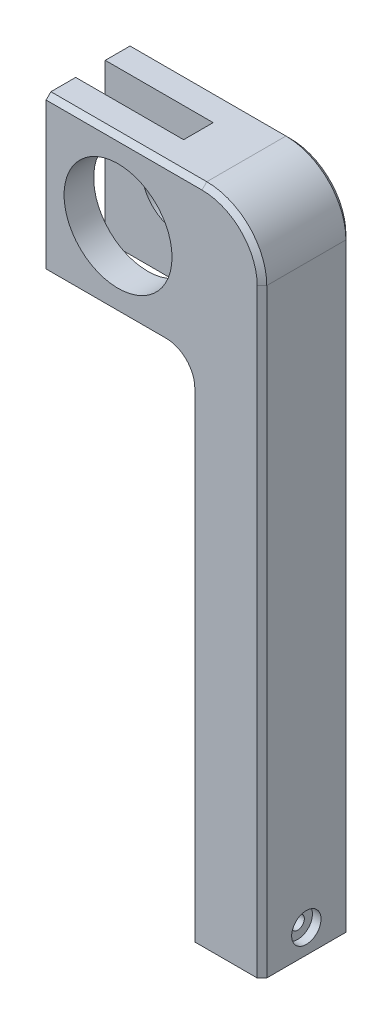
ISO-10303-21;
HEADER;
FILE_DESCRIPTION(('STEP AP214'),'2;1');
FILE_NAME('part.step','',(''),(''),'','','');
FILE_SCHEMA(('AUTOMOTIVE_DESIGN { 1 0 10303 214 1 1 1 1 }'));
ENDSEC;
DATA;
#1=APPLICATION_CONTEXT('core data for automotive mechanical design processes');
#2=APPLICATION_PROTOCOL_DEFINITION('international standard','automotive_design',2000,#1);
#3=PRODUCT_CONTEXT('',#1,'mechanical');
#4=PRODUCT('Part','Part','',(#3));
#5=PRODUCT_RELATED_PRODUCT_CATEGORY('part','',(#4));
#6=PRODUCT_DEFINITION_FORMATION('','',#4);
#7=PRODUCT_DEFINITION_CONTEXT('part definition',#1,'design');
#8=PRODUCT_DEFINITION('design','',#6,#7);
#9=PRODUCT_DEFINITION_SHAPE('','',#8);
#10=(LENGTH_UNIT() NAMED_UNIT(*) SI_UNIT(.MILLI.,.METRE.));
#11=(NAMED_UNIT(*) PLANE_ANGLE_UNIT() SI_UNIT($,.RADIAN.));
#12=(NAMED_UNIT(*) SI_UNIT($,.STERADIAN.) SOLID_ANGLE_UNIT());
#13=UNCERTAINTY_MEASURE_WITH_UNIT(LENGTH_MEASURE(1.E-05),#10,'distance_accuracy_value','');
#14=(GEOMETRIC_REPRESENTATION_CONTEXT(3) GLOBAL_UNCERTAINTY_ASSIGNED_CONTEXT((#13)) GLOBAL_UNIT_ASSIGNED_CONTEXT((#10,
#11,#12)) REPRESENTATION_CONTEXT('',''));
#15=CARTESIAN_POINT('',(0.,0.,0.));
#16=DIRECTION('',(0.,0.,1.));
#17=DIRECTION('',(1.,0.,0.));
#18=AXIS2_PLACEMENT_3D('',#15,#16,#17);
#19=CARTESIAN_POINT('',(-45.,-0.00100000000002876,6.16499999999999));
#20=DIRECTION('',(0.,0.,1.));
#21=DIRECTION('',(1.,0.,0.));
#22=AXIS2_PLACEMENT_3D('',#19,#20,#21);
#23=PLANE('',#22);
#24=CARTESIAN_POINT('',(-60.,242.5,6.16499999999999));
#25=DIRECTION('',(0.,0.,1.));
#26=DIRECTION('',(1.,0.,0.));
#27=AXIS2_PLACEMENT_3D('',#24,#25,#26);
#28=CIRCLE('',#27,22.5);
#29=CARTESIAN_POINT('',(-45.,225.729490168752,6.16499999999999));
#30=VERTEX_POINT('',#29);
#31=CARTESIAN_POINT('',(-45.,259.270509831248,6.16499999999999));
#32=VERTEX_POINT('',#31);
#33=EDGE_CURVE('E260',#30,#32,#28,.F.);
#34=ORIENTED_EDGE('',*,*,#33,.F.);
#35=DIRECTION('',(0.,1.,0.));
#36=VECTOR('',#35,1.);
#37=CARTESIAN_POINT('',(-45.,-0.00100000000002876,6.16499999999999));
#38=LINE('',#37,#36);
#39=CARTESIAN_POINT('',(-45.,210.,6.16499999999999));
#40=VERTEX_POINT('',#39);
#41=EDGE_CURVE('E281',#40,#30,#38,.T.);
#42=ORIENTED_EDGE('',*,*,#41,.F.);
#43=DIRECTION('',(1.,0.,0.));
#44=VECTOR('',#43,1.);
#45=CARTESIAN_POINT('',(-45.,210.,6.16499999999999));
#46=LINE('',#45,#44);
#47=CARTESIAN_POINT('',(-90.,210.,6.165));
#48=VERTEX_POINT('',#47);
#49=EDGE_CURVE('E277',#48,#40,#46,.T.);
#50=ORIENTED_EDGE('',*,*,#49,.F.);
#51=DIRECTION('',(0.,1.,0.));
#52=VECTOR('',#51,1.);
#53=CARTESIAN_POINT('',(-90.,-0.00100000000002876,6.165));
#54=LINE('',#53,#52);
#55=CARTESIAN_POINT('',(-90.,275.,6.165));
#56=VERTEX_POINT('',#55);
#57=EDGE_CURVE('E279',#48,#56,#54,.T.);
#58=ORIENTED_EDGE('',*,*,#57,.T.);
#59=DIRECTION('',(1.,0.,0.));
#60=VECTOR('',#59,1.);
#61=CARTESIAN_POINT('',(-45.,275.,6.16499999999999));
#62=LINE('',#61,#60);
#63=CARTESIAN_POINT('',(-45.,275.,6.16499999999999));
#64=VERTEX_POINT('',#63);
#65=EDGE_CURVE('E270',#56,#64,#62,.T.);
#66=ORIENTED_EDGE('',*,*,#65,.T.);
#67=EDGE_CURVE('E290',#32,#64,#38,.T.);
#68=ORIENTED_EDGE('',*,*,#67,.F.);
#69=EDGE_LOOP('',(#34,#42,#50,#58,#66,#68));
#70=FACE_BOUND('',#69,.T.);
#71=ADVANCED_FACE('F44',(#70),#23,.F.);
#72=CARTESIAN_POINT('',(-90.,210.,-18.5));
#73=DIRECTION('',(-1.,0.,0.));
#74=DIRECTION('',(0.,0.,1.));
#75=AXIS2_PLACEMENT_3D('',#72,#73,#74);
#76=PLANE('',#75);
#77=CARTESIAN_POINT('',(-90.,215.,-12.33));
#78=DIRECTION('',(-1.,0.,0.));
#79=DIRECTION('',(0.,0.,1.));
#80=AXIS2_PLACEMENT_3D('',#77,#78,#79);
#81=CIRCLE('',#80,1.5);
#82=CARTESIAN_POINT('',(-90.,215.,-10.83));
#83=VERTEX_POINT('',#82);
#84=EDGE_CURVE('E214',#83,#83,#81,.T.);
#85=ORIENTED_EDGE('',*,*,#84,.F.);
#86=EDGE_LOOP('',(#85));
#87=FACE_BOUND('',#86,.T.);
#88=CARTESIAN_POINT('',(-90.,270.,-12.33));
#89=DIRECTION('',(-1.,0.,0.));
#90=DIRECTION('',(0.,0.,1.));
#91=AXIS2_PLACEMENT_3D('',#88,#89,#90);
#92=CIRCLE('',#91,1.5);
#93=CARTESIAN_POINT('',(-90.,270.,-10.83));
#94=VERTEX_POINT('',#93);
#95=EDGE_CURVE('E225',#94,#94,#92,.T.);
#96=ORIENTED_EDGE('',*,*,#95,.F.);
#97=EDGE_LOOP('',(#96));
#98=FACE_BOUND('',#97,.T.);
#99=DIRECTION('',(0.,-1.,0.));
#100=VECTOR('',#99,1.);
#101=CARTESIAN_POINT('',(-90.,210.,-18.5));
#102=LINE('',#101,#100);
#103=CARTESIAN_POINT('',(-90.,273.,-18.5));
#104=VERTEX_POINT('',#103);
#105=CARTESIAN_POINT('',(-90.,212.,-18.5));
#106=VERTEX_POINT('',#105);
#107=EDGE_CURVE('E292',#104,#106,#102,.T.);
#108=ORIENTED_EDGE('',*,*,#107,.T.);
#109=DIRECTION('',(0.,0.707106781186548,-0.707106781186548));
#110=VECTOR('',#109,1.);
#111=CARTESIAN_POINT('',(-90.,211.,-17.5));
#112=LINE('',#111,#110);
#113=CARTESIAN_POINT('',(-90.,210.,-16.5));
#114=VERTEX_POINT('',#113);
#115=EDGE_CURVE('E378',#106,#114,#112,.F.);
#116=ORIENTED_EDGE('',*,*,#115,.T.);
#117=DIRECTION('',(0.,0.,1.));
#118=VECTOR('',#117,1.);
#119=CARTESIAN_POINT('',(-90.,210.,-18.5));
#120=LINE('',#119,#118);
#121=CARTESIAN_POINT('',(-90.,210.,-6.165));
#122=VERTEX_POINT('',#121);
#123=EDGE_CURVE('E311',#114,#122,#120,.T.);
#124=ORIENTED_EDGE('',*,*,#123,.T.);
#125=DIRECTION('',(0.,1.,0.));
#126=VECTOR('',#125,1.);
#127=CARTESIAN_POINT('',(-90.,-0.00100000000002876,-6.165));
#128=LINE('',#127,#126);
#129=CARTESIAN_POINT('',(-90.,275.,-6.165));
#130=VERTEX_POINT('',#129);
#131=EDGE_CURVE('E276',#122,#130,#128,.T.);
#132=ORIENTED_EDGE('',*,*,#131,.T.);
#133=DIRECTION('',(0.,0.,1.));
#134=VECTOR('',#133,1.);
#135=CARTESIAN_POINT('',(-90.,275.,-18.5));
#136=LINE('',#135,#134);
#137=CARTESIAN_POINT('',(-90.,275.,-16.5));
#138=VERTEX_POINT('',#137);
#139=EDGE_CURVE('E313',#138,#130,#136,.T.);
#140=ORIENTED_EDGE('',*,*,#139,.F.);
#141=DIRECTION('',(0.,0.707106781186548,0.707106781186548));
#142=VECTOR('',#141,1.);
#143=CARTESIAN_POINT('',(-90.,241.5,-50.));
#144=LINE('',#143,#142);
#145=EDGE_CURVE('E380',#138,#104,#144,.F.);
#146=ORIENTED_EDGE('',*,*,#145,.T.);
#147=EDGE_LOOP('',(#108,#116,#124,#132,#140,#146));
#148=FACE_BOUND('',#147,.T.);
#149=ADVANCED_FACE('F497',(#87,#98,#148),#76,.T.);
#150=CARTESIAN_POINT('',(-30.,210.,-18.5));
#151=DIRECTION('',(0.,-1.,0.));
#152=DIRECTION('',(0.,0.,-1.));
#153=AXIS2_PLACEMENT_3D('',#150,#151,#152);
#154=PLANE('',#153);
#155=DIRECTION('',(0.,0.,1.));
#156=VECTOR('',#155,1.);
#157=CARTESIAN_POINT('',(-40.,210.,18.5));
#158=LINE('',#157,#156);
#159=CARTESIAN_POINT('',(-40.,210.,-16.5));
#160=VERTEX_POINT('',#159);
#161=CARTESIAN_POINT('',(-40.,210.,16.5));
#162=VERTEX_POINT('',#161);
#163=EDGE_CURVE('E318',#160,#162,#158,.T.);
#164=ORIENTED_EDGE('',*,*,#163,.T.);
#165=DIRECTION('',(-1.,0.,0.));
#166=VECTOR('',#165,1.);
#167=CARTESIAN_POINT('',(-90.,210.,16.5));
#168=LINE('',#167,#166);
#169=CARTESIAN_POINT('',(-90.,210.,16.5));
#170=VERTEX_POINT('',#169);
#171=EDGE_CURVE('E345',#162,#170,#168,.T.);
#172=ORIENTED_EDGE('',*,*,#171,.T.);
#173=EDGE_CURVE('E312',#48,#170,#120,.T.);
#174=ORIENTED_EDGE('',*,*,#173,.F.);
#175=ORIENTED_EDGE('',*,*,#49,.T.);
#176=DIRECTION('',(0.,0.,-1.));
#177=VECTOR('',#176,1.);
#178=CARTESIAN_POINT('',(-45.,210.,6.16499999999999));
#179=LINE('',#178,#177);
#180=CARTESIAN_POINT('',(-45.,210.,-6.16499999999999));
#181=VERTEX_POINT('',#180);
#182=EDGE_CURVE('E263',#40,#181,#179,.T.);
#183=ORIENTED_EDGE('',*,*,#182,.T.);
#184=DIRECTION('',(-1.,0.,0.));
#185=VECTOR('',#184,1.);
#186=CARTESIAN_POINT('',(-45.,210.,-6.16499999999999));
#187=LINE('',#186,#185);
#188=EDGE_CURVE('E264',#181,#122,#187,.T.);
#189=ORIENTED_EDGE('',*,*,#188,.T.);
#190=ORIENTED_EDGE('',*,*,#123,.F.);
#191=DIRECTION('',(1.,0.,0.));
#192=VECTOR('',#191,1.);
#193=CARTESIAN_POINT('',(-30.,210.,-16.5));
#194=LINE('',#193,#192);
#195=EDGE_CURVE('E338',#114,#160,#194,.T.);
#196=ORIENTED_EDGE('',*,*,#195,.T.);
#197=EDGE_LOOP('',(#164,#172,#174,#175,#183,#189,#190,#196));
#198=FACE_BOUND('',#197,.T.);
#199=ADVANCED_FACE('F474',(#198),#154,.T.);
#200=CARTESIAN_POINT('',(0.,275.,-18.5));
#201=DIRECTION('',(1.,0.,0.));
#202=DIRECTION('',(0.,1.,0.));
#203=AXIS2_PLACEMENT_3D('',#200,#201,#202);
#204=PLANE('',#203);
#205=CARTESIAN_POINT('',(0.,10.,0.));
#206=DIRECTION('',(1.,0.,0.));
#207=DIRECTION('',(0.,0.,-1.));
#208=AXIS2_PLACEMENT_3D('',#205,#206,#207);
#209=CIRCLE('',#208,6.12);
#210=CARTESIAN_POINT('',(0.,10.,-6.12));
#211=VERTEX_POINT('',#210);
#212=EDGE_CURVE('E234',#211,#211,#209,.T.);
#213=ORIENTED_EDGE('',*,*,#212,.F.);
#214=EDGE_LOOP('',(#213));
#215=FACE_BOUND('',#214,.T.);
#216=DIRECTION('',(0.,0.,1.));
#217=VECTOR('',#216,1.);
#218=CARTESIAN_POINT('',(0.,0.,-18.5));
#219=LINE('',#218,#217);
#220=CARTESIAN_POINT('',(0.,0.,-16.5));
#221=VERTEX_POINT('',#220);
#222=CARTESIAN_POINT('',(0.,0.,16.5));
#223=VERTEX_POINT('',#222);
#224=EDGE_CURVE('E302',#221,#223,#219,.T.);
#225=ORIENTED_EDGE('',*,*,#224,.F.);
#226=DIRECTION('',(0.,1.,0.));
#227=VECTOR('',#226,1.);
#228=CARTESIAN_POINT('',(0.,275.,-16.5));
#229=LINE('',#228,#227);
#230=CARTESIAN_POINT('',(0.,250.,-16.5));
#231=VERTEX_POINT('',#230);
#232=EDGE_CURVE('E11',#221,#231,#229,.T.);
#233=ORIENTED_EDGE('',*,*,#232,.T.);
#234=DIRECTION('',(0.,0.,1.));
#235=VECTOR('',#234,1.);
#236=CARTESIAN_POINT('',(0.,250.,-18.5));
#237=LINE('',#236,#235);
#238=CARTESIAN_POINT('',(0.,250.,16.5));
#239=VERTEX_POINT('',#238);
#240=EDGE_CURVE('E310',#231,#239,#237,.T.);
#241=ORIENTED_EDGE('',*,*,#240,.T.);
#242=DIRECTION('',(0.,-1.,0.));
#243=VECTOR('',#242,1.);
#244=CARTESIAN_POINT('',(0.,0.,16.5));
#245=LINE('',#244,#243);
#246=EDGE_CURVE('E54',#239,#223,#245,.T.);
#247=ORIENTED_EDGE('',*,*,#246,.T.);
#248=EDGE_LOOP('',(#225,#233,#241,#247));
#249=FACE_BOUND('',#248,.T.);
#250=ADVANCED_FACE('F419',(#215,#249),#204,.T.);
#251=CARTESIAN_POINT('',(0.,0.,-18.5));
#252=DIRECTION('',(0.,-1.,0.));
#253=DIRECTION('',(1.,0.,0.));
#254=AXIS2_PLACEMENT_3D('',#251,#252,#253);
#255=PLANE('',#254);
#256=DIRECTION('',(1.,0.,0.));
#257=VECTOR('',#256,1.);
#258=CARTESIAN_POINT('',(0.,0.,18.5));
#259=LINE('',#258,#257);
#260=CARTESIAN_POINT('',(-28.,0.,18.5));
#261=VERTEX_POINT('',#260);
#262=CARTESIAN_POINT('',(-2.,0.,18.5));
#263=VERTEX_POINT('',#262);
#264=EDGE_CURVE('E298',#261,#263,#259,.T.);
#265=ORIENTED_EDGE('',*,*,#264,.F.);
#266=DIRECTION('',(-0.707106781186548,0.,-0.707106781186548));
#267=VECTOR('',#266,1.);
#268=CARTESIAN_POINT('',(-32.5,0.,14.));
#269=LINE('',#268,#267);
#270=CARTESIAN_POINT('',(-30.,0.,16.5));
#271=VERTEX_POINT('',#270);
#272=EDGE_CURVE('E360',#261,#271,#269,.T.);
#273=ORIENTED_EDGE('',*,*,#272,.T.);
#274=DIRECTION('',(0.,0.,1.));
#275=VECTOR('',#274,1.);
#276=CARTESIAN_POINT('',(-30.,0.,-18.5));
#277=LINE('',#276,#275);
#278=CARTESIAN_POINT('',(-30.,0.,-16.5));
#279=VERTEX_POINT('',#278);
#280=EDGE_CURVE('E308',#279,#271,#277,.T.);
#281=ORIENTED_EDGE('',*,*,#280,.F.);
#282=DIRECTION('',(-0.707106781186548,0.,0.707106781186548));
#283=VECTOR('',#282,1.);
#284=CARTESIAN_POINT('',(-14.,0.,-32.5));
#285=LINE('',#284,#283);
#286=CARTESIAN_POINT('',(-28.,0.,-18.5));
#287=VERTEX_POINT('',#286);
#288=EDGE_CURVE('E357',#279,#287,#285,.F.);
#289=ORIENTED_EDGE('',*,*,#288,.T.);
#290=DIRECTION('',(1.,0.,0.));
#291=VECTOR('',#290,1.);
#292=CARTESIAN_POINT('',(0.,0.,-18.5));
#293=LINE('',#292,#291);
#294=CARTESIAN_POINT('',(-2.,0.,-18.5));
#295=VERTEX_POINT('',#294);
#296=EDGE_CURVE('E294',#287,#295,#293,.T.);
#297=ORIENTED_EDGE('',*,*,#296,.T.);
#298=DIRECTION('',(-0.707106781186548,0.,-0.707106781186548));
#299=VECTOR('',#298,1.);
#300=CARTESIAN_POINT('',(-1.,0.,-17.5));
#301=LINE('',#300,#299);
#302=EDGE_CURVE('E353',#295,#221,#301,.F.);
#303=ORIENTED_EDGE('',*,*,#302,.T.);
#304=ORIENTED_EDGE('',*,*,#224,.T.);
#305=DIRECTION('',(-0.707106781186548,0.,0.707106781186548));
#306=VECTOR('',#305,1.);
#307=CARTESIAN_POINT('',(17.5,0.,-1.));
#308=LINE('',#307,#306);
#309=EDGE_CURVE('E354',#223,#263,#308,.T.);
#310=ORIENTED_EDGE('',*,*,#309,.T.);
#311=EDGE_LOOP('',(#265,#273,#281,#289,#297,#303,#304,#310));
#312=FACE_BOUND('',#311,.T.);
#313=ADVANCED_FACE('F423',(#312),#255,.T.);
#314=CARTESIAN_POINT('',(-30.,210.,-18.5));
#315=DIRECTION('',(-1.,0.,0.));
#316=DIRECTION('',(0.,-1.,0.));
#317=AXIS2_PLACEMENT_3D('',#314,#315,#316);
#318=PLANE('',#317);
#319=CARTESIAN_POINT('',(-30.,10.,0.));
#320=DIRECTION('',(-1.,0.,0.));
#321=DIRECTION('',(0.,-1.,0.));
#322=AXIS2_PLACEMENT_3D('',#319,#320,#321);
#323=CIRCLE('',#322,2.75);
#324=CARTESIAN_POINT('',(-30.,7.25,0.));
#325=VERTEX_POINT('',#324);
#326=EDGE_CURVE('E243',#325,#325,#323,.T.);
#327=ORIENTED_EDGE('',*,*,#326,.F.);
#328=EDGE_LOOP('',(#327));
#329=FACE_BOUND('',#328,.T.);
#330=ORIENTED_EDGE('',*,*,#280,.T.);
#331=DIRECTION('',(0.,1.,0.));
#332=VECTOR('',#331,1.);
#333=CARTESIAN_POINT('',(-30.,200.,16.5));
#334=LINE('',#333,#332);
#335=CARTESIAN_POINT('',(-30.,200.,16.5));
#336=VERTEX_POINT('',#335);
#337=EDGE_CURVE('E361',#271,#336,#334,.T.);
#338=ORIENTED_EDGE('',*,*,#337,.T.);
#339=DIRECTION('',(0.,0.,1.));
#340=VECTOR('',#339,1.);
#341=CARTESIAN_POINT('',(-30.,200.,-18.5));
#342=LINE('',#341,#340);
#343=CARTESIAN_POINT('',(-30.,200.,-16.5));
#344=VERTEX_POINT('',#343);
#345=EDGE_CURVE('E325',#336,#344,#342,.F.);
#346=ORIENTED_EDGE('',*,*,#345,.T.);
#347=DIRECTION('',(0.,-1.,0.));
#348=VECTOR('',#347,1.);
#349=CARTESIAN_POINT('',(-30.,210.,-16.5));
#350=LINE('',#349,#348);
#351=EDGE_CURVE('E363',#344,#279,#350,.T.);
#352=ORIENTED_EDGE('',*,*,#351,.T.);
#353=EDGE_LOOP('',(#330,#338,#346,#352));
#354=FACE_BOUND('',#353,.T.);
#355=ADVANCED_FACE('F488',(#329,#354),#318,.T.);
#356=CARTESIAN_POINT('',(-90.,270.,12.33));
#357=DIRECTION('',(-1.,0.,0.));
#358=DIRECTION('',(0.,0.,1.));
#359=AXIS2_PLACEMENT_3D('',#356,#357,#358);
#360=CIRCLE('',#359,1.5);
#361=CARTESIAN_POINT('',(-90.,270.,13.83));
#362=VERTEX_POINT('',#361);
#363=EDGE_CURVE('E211',#362,#362,#360,.T.);
#364=ORIENTED_EDGE('',*,*,#363,.F.);
#365=EDGE_LOOP('',(#364));
#366=FACE_BOUND('',#365,.T.);
#367=CARTESIAN_POINT('',(-90.,215.,12.33));
#368=DIRECTION('',(-1.,0.,0.));
#369=DIRECTION('',(0.,0.,1.));
#370=AXIS2_PLACEMENT_3D('',#367,#368,#369);
#371=CIRCLE('',#370,1.5);
#372=CARTESIAN_POINT('',(-90.,215.,13.83));
#373=VERTEX_POINT('',#372);
#374=EDGE_CURVE('E226',#373,#373,#371,.T.);
#375=ORIENTED_EDGE('',*,*,#374,.F.);
#376=EDGE_LOOP('',(#375));
#377=FACE_BOUND('',#376,.T.);
#378=ORIENTED_EDGE('',*,*,#173,.T.);
#379=DIRECTION('',(0.,0.707106781186548,0.707106781186548));
#380=VECTOR('',#379,1.);
#381=CARTESIAN_POINT('',(-90.,192.5,-1.00000000000001));
#382=LINE('',#381,#380);
#383=CARTESIAN_POINT('',(-90.,212.,18.5));
#384=VERTEX_POINT('',#383);
#385=EDGE_CURVE('E350',#170,#384,#382,.T.);
#386=ORIENTED_EDGE('',*,*,#385,.T.);
#387=DIRECTION('',(0.,-1.,0.));
#388=VECTOR('',#387,1.);
#389=CARTESIAN_POINT('',(-90.,210.,18.5));
#390=LINE('',#389,#388);
#391=CARTESIAN_POINT('',(-90.,273.,18.5));
#392=VERTEX_POINT('',#391);
#393=EDGE_CURVE('E293',#392,#384,#390,.T.);
#394=ORIENTED_EDGE('',*,*,#393,.F.);
#395=DIRECTION('',(0.,0.707106781186548,-0.707106781186548));
#396=VECTOR('',#395,1.);
#397=CARTESIAN_POINT('',(-90.,260.,31.5));
#398=LINE('',#397,#396);
#399=CARTESIAN_POINT('',(-90.,275.,16.5));
#400=VERTEX_POINT('',#399);
#401=EDGE_CURVE('E342',#392,#400,#398,.T.);
#402=ORIENTED_EDGE('',*,*,#401,.T.);
#403=EDGE_CURVE('E299',#56,#400,#136,.T.);
#404=ORIENTED_EDGE('',*,*,#403,.F.);
#405=ORIENTED_EDGE('',*,*,#57,.F.);
#406=EDGE_LOOP('',(#378,#386,#394,#402,#404,#405));
#407=FACE_BOUND('',#406,.T.);
#408=ADVANCED_FACE('F449',(#366,#377,#407),#76,.T.);
#409=CARTESIAN_POINT('',(-90.,275.,-18.5));
#410=DIRECTION('',(0.,1.,0.));
#411=DIRECTION('',(0.,0.,1.));
#412=AXIS2_PLACEMENT_3D('',#409,#410,#411);
#413=PLANE('',#412);
#414=DIRECTION('',(0.,0.,1.));
#415=VECTOR('',#414,1.);
#416=CARTESIAN_POINT('',(-25.,275.,-18.5));
#417=LINE('',#416,#415);
#418=CARTESIAN_POINT('',(-25.,275.,16.5));
#419=VERTEX_POINT('',#418);
#420=CARTESIAN_POINT('',(-25.,275.,-16.5));
#421=VERTEX_POINT('',#420);
#422=EDGE_CURVE('E320',#419,#421,#417,.F.);
#423=ORIENTED_EDGE('',*,*,#422,.T.);
#424=DIRECTION('',(-1.,0.,0.));
#425=VECTOR('',#424,1.);
#426=CARTESIAN_POINT('',(-90.,275.,-16.5));
#427=LINE('',#426,#425);
#428=EDGE_CURVE('E384',#421,#138,#427,.T.);
#429=ORIENTED_EDGE('',*,*,#428,.T.);
#430=ORIENTED_EDGE('',*,*,#139,.T.);
#431=DIRECTION('',(-1.,0.,0.));
#432=VECTOR('',#431,1.);
#433=CARTESIAN_POINT('',(-45.,275.,-6.16499999999999));
#434=LINE('',#433,#432);
#435=CARTESIAN_POINT('',(-45.,275.,-6.16499999999999));
#436=VERTEX_POINT('',#435);
#437=EDGE_CURVE('E271',#436,#130,#434,.T.);
#438=ORIENTED_EDGE('',*,*,#437,.F.);
#439=DIRECTION('',(0.,0.,-1.));
#440=VECTOR('',#439,1.);
#441=CARTESIAN_POINT('',(-45.,275.,6.16499999999999));
#442=LINE('',#441,#440);
#443=EDGE_CURVE('E268',#64,#436,#442,.T.);
#444=ORIENTED_EDGE('',*,*,#443,.F.);
#445=ORIENTED_EDGE('',*,*,#65,.F.);
#446=ORIENTED_EDGE('',*,*,#403,.T.);
#447=DIRECTION('',(1.,0.,0.));
#448=VECTOR('',#447,1.);
#449=CARTESIAN_POINT('',(-25.,275.,16.5));
#450=LINE('',#449,#448);
#451=EDGE_CURVE('E382',#400,#419,#450,.T.);
#452=ORIENTED_EDGE('',*,*,#451,.T.);
#453=EDGE_LOOP('',(#423,#429,#430,#438,#444,#445,#446,#452));
#454=FACE_BOUND('',#453,.T.);
#455=ADVANCED_FACE('F436',(#454),#413,.T.);
#456=CARTESIAN_POINT('',(0.,0.,-18.5));
#457=DIRECTION('',(0.,0.,-1.));
#458=DIRECTION('',(-1.,0.,0.));
#459=AXIS2_PLACEMENT_3D('',#456,#457,#458);
#460=PLANE('',#459);
#461=CARTESIAN_POINT('',(-60.,242.5,-18.5));
#462=DIRECTION('',(0.,0.,-1.));
#463=DIRECTION('',(-1.,0.,0.));
#464=AXIS2_PLACEMENT_3D('',#461,#462,#463);
#465=CIRCLE('',#464,14.625);
#466=CARTESIAN_POINT('',(-74.625,242.5,-18.5));
#467=VERTEX_POINT('',#466);
#468=EDGE_CURVE('E250',#467,#467,#465,.T.);
#469=ORIENTED_EDGE('',*,*,#468,.F.);
#470=EDGE_LOOP('',(#469));
#471=FACE_BOUND('',#470,.T.);
#472=CARTESIAN_POINT('',(-40.,200.,-18.5));
#473=DIRECTION('',(0.,0.,-1.));
#474=DIRECTION('',(-1.,0.,0.));
#475=AXIS2_PLACEMENT_3D('',#472,#473,#474);
#476=CIRCLE('',#475,12.);
#477=CARTESIAN_POINT('',(-28.,200.,-18.5));
#478=VERTEX_POINT('',#477);
#479=CARTESIAN_POINT('',(-40.,212.,-18.5));
#480=VERTEX_POINT('',#479);
#481=EDGE_CURVE('E373',#478,#480,#476,.F.);
#482=ORIENTED_EDGE('',*,*,#481,.T.);
#483=DIRECTION('',(-1.,0.,0.));
#484=VECTOR('',#483,1.);
#485=CARTESIAN_POINT('',(0.,212.,-18.5));
#486=LINE('',#485,#484);
#487=EDGE_CURVE('E374',#480,#106,#486,.T.);
#488=ORIENTED_EDGE('',*,*,#487,.T.);
#489=ORIENTED_EDGE('',*,*,#107,.F.);
#490=DIRECTION('',(1.,0.,0.));
#491=VECTOR('',#490,1.);
#492=CARTESIAN_POINT('',(0.,273.,-18.5));
#493=LINE('',#492,#491);
#494=CARTESIAN_POINT('',(-25.,273.,-18.5));
#495=VERTEX_POINT('',#494);
#496=EDGE_CURVE('E367',#104,#495,#493,.T.);
#497=ORIENTED_EDGE('',*,*,#496,.T.);
#498=CARTESIAN_POINT('',(-25.,250.,-18.5));
#499=DIRECTION('',(0.,0.,-1.));
#500=DIRECTION('',(-1.,0.,0.));
#501=AXIS2_PLACEMENT_3D('',#498,#499,#500);
#502=CIRCLE('',#501,23.);
#503=CARTESIAN_POINT('',(-2.00000000000001,250.,-18.5));
#504=VERTEX_POINT('',#503);
#505=EDGE_CURVE('E370',#495,#504,#502,.T.);
#506=ORIENTED_EDGE('',*,*,#505,.T.);
#507=DIRECTION('',(0.,-1.,0.));
#508=VECTOR('',#507,1.);
#509=CARTESIAN_POINT('',(-2.,0.,-18.5));
#510=LINE('',#509,#508);
#511=EDGE_CURVE('E362',#504,#295,#510,.T.);
#512=ORIENTED_EDGE('',*,*,#511,.T.);
#513=ORIENTED_EDGE('',*,*,#296,.F.);
#514=DIRECTION('',(0.,1.,0.));
#515=VECTOR('',#514,1.);
#516=CARTESIAN_POINT('',(-28.,0.,-18.5));
#517=LINE('',#516,#515);
#518=EDGE_CURVE('E371',#287,#478,#517,.T.);
#519=ORIENTED_EDGE('',*,*,#518,.T.);
#520=EDGE_LOOP('',(#482,#488,#489,#497,#506,#512,#513,#519));
#521=FACE_BOUND('',#520,.T.);
#522=ADVANCED_FACE('F491',(#471,#521),#460,.T.);
#523=CARTESIAN_POINT('',(0.,0.,18.5));
#524=DIRECTION('',(0.,0.,-1.));
#525=DIRECTION('',(-1.,0.,0.));
#526=AXIS2_PLACEMENT_3D('',#523,#524,#525);
#527=PLANE('',#526);
#528=CARTESIAN_POINT('',(-60.,242.5,18.5));
#529=DIRECTION('',(0.,0.,1.));
#530=DIRECTION('',(1.,0.,0.));
#531=AXIS2_PLACEMENT_3D('',#528,#529,#530);
#532=CIRCLE('',#531,22.5);
#533=CARTESIAN_POINT('',(-37.5,242.5,18.5));
#534=VERTEX_POINT('',#533);
#535=EDGE_CURVE('E251',#534,#534,#532,.T.);
#536=ORIENTED_EDGE('',*,*,#535,.F.);
#537=EDGE_LOOP('',(#536));
#538=FACE_BOUND('',#537,.T.);
#539=ORIENTED_EDGE('',*,*,#393,.T.);
#540=DIRECTION('',(1.,0.,0.));
#541=VECTOR('',#540,1.);
#542=CARTESIAN_POINT('',(-40.,212.,18.5));
#543=LINE('',#542,#541);
#544=CARTESIAN_POINT('',(-40.,212.,18.5));
#545=VERTEX_POINT('',#544);
#546=EDGE_CURVE('E340',#384,#545,#543,.T.);
#547=ORIENTED_EDGE('',*,*,#546,.T.);
#548=CARTESIAN_POINT('',(-40.,200.,18.5));
#549=DIRECTION('',(0.,0.,-1.));
#550=DIRECTION('',(-1.,0.,0.));
#551=AXIS2_PLACEMENT_3D('',#548,#549,#550);
#552=CIRCLE('',#551,12.);
#553=CARTESIAN_POINT('',(-28.,200.,18.5));
#554=VERTEX_POINT('',#553);
#555=EDGE_CURVE('E333',#545,#554,#552,.T.);
#556=ORIENTED_EDGE('',*,*,#555,.T.);
#557=DIRECTION('',(0.,-1.,0.));
#558=VECTOR('',#557,1.);
#559=CARTESIAN_POINT('',(-28.,0.,18.5));
#560=LINE('',#559,#558);
#561=EDGE_CURVE('E334',#554,#261,#560,.T.);
#562=ORIENTED_EDGE('',*,*,#561,.T.);
#563=ORIENTED_EDGE('',*,*,#264,.T.);
#564=DIRECTION('',(0.,1.,0.));
#565=VECTOR('',#564,1.);
#566=CARTESIAN_POINT('',(-2.00000000000001,250.,18.5));
#567=LINE('',#566,#565);
#568=CARTESIAN_POINT('',(-2.00000000000001,250.,18.5));
#569=VERTEX_POINT('',#568);
#570=EDGE_CURVE('E328',#263,#569,#567,.T.);
#571=ORIENTED_EDGE('',*,*,#570,.T.);
#572=CARTESIAN_POINT('',(-25.,250.,18.5));
#573=DIRECTION('',(0.,0.,-1.));
#574=DIRECTION('',(-1.,0.,0.));
#575=AXIS2_PLACEMENT_3D('',#572,#573,#574);
#576=CIRCLE('',#575,23.);
#577=CARTESIAN_POINT('',(-25.,273.,18.5));
#578=VERTEX_POINT('',#577);
#579=EDGE_CURVE('E326',#569,#578,#576,.F.);
#580=ORIENTED_EDGE('',*,*,#579,.T.);
#581=DIRECTION('',(-1.,0.,0.));
#582=VECTOR('',#581,1.);
#583=CARTESIAN_POINT('',(-90.,273.,18.5));
#584=LINE('',#583,#582);
#585=EDGE_CURVE('E327',#578,#392,#584,.T.);
#586=ORIENTED_EDGE('',*,*,#585,.T.);
#587=EDGE_LOOP('',(#539,#547,#556,#562,#563,#571,#580,#586));
#588=FACE_BOUND('',#587,.T.);
#589=ADVANCED_FACE('F444',(#538,#588),#527,.F.);
#590=CARTESIAN_POINT('',(-45.,-0.00100000000002876,-6.16499999999999));
#591=DIRECTION('',(0.,0.,-1.));
#592=DIRECTION('',(-1.,0.,0.));
#593=AXIS2_PLACEMENT_3D('',#590,#591,#592);
#594=PLANE('',#593);
#595=CARTESIAN_POINT('',(-60.,242.5,-6.165));
#596=DIRECTION('',(0.,0.,-1.));
#597=DIRECTION('',(-1.,0.,0.));
#598=AXIS2_PLACEMENT_3D('',#595,#596,#597);
#599=CIRCLE('',#598,14.625);
#600=CARTESIAN_POINT('',(-74.625,242.5,-6.165));
#601=VERTEX_POINT('',#600);
#602=EDGE_CURVE('E249',#601,#601,#599,.F.);
#603=ORIENTED_EDGE('',*,*,#602,.F.);
#604=EDGE_LOOP('',(#603));
#605=FACE_BOUND('',#604,.T.);
#606=DIRECTION('',(0.,1.,0.));
#607=VECTOR('',#606,1.);
#608=CARTESIAN_POINT('',(-45.,-0.00100000000002876,-6.16499999999999));
#609=LINE('',#608,#607);
#610=EDGE_CURVE('E283',#181,#436,#609,.T.);
#611=ORIENTED_EDGE('',*,*,#610,.T.);
#612=ORIENTED_EDGE('',*,*,#437,.T.);
#613=ORIENTED_EDGE('',*,*,#131,.F.);
#614=ORIENTED_EDGE('',*,*,#188,.F.);
#615=EDGE_LOOP('',(#611,#612,#613,#614));
#616=FACE_BOUND('',#615,.T.);
#617=ADVANCED_FACE('F502',(#605,#616),#594,.F.);
#618=CARTESIAN_POINT('',(-45.,-0.00100000000002876,6.16499999999999));
#619=DIRECTION('',(1.,0.,0.));
#620=DIRECTION('',(0.,0.,-1.));
#621=AXIS2_PLACEMENT_3D('',#618,#619,#620);
#622=PLANE('',#621);
#623=ORIENTED_EDGE('',*,*,#41,.T.);
#624=EDGE_CURVE('E287',#30,#32,#38,.T.);
#625=ORIENTED_EDGE('',*,*,#624,.T.);
#626=ORIENTED_EDGE('',*,*,#67,.T.);
#627=ORIENTED_EDGE('',*,*,#443,.T.);
#628=ORIENTED_EDGE('',*,*,#610,.F.);
#629=ORIENTED_EDGE('',*,*,#182,.F.);
#630=EDGE_LOOP('',(#623,#625,#626,#627,#628,#629));
#631=FACE_BOUND('',#630,.T.);
#632=ADVANCED_FACE('F510',(#631),#622,.F.);
#633=CARTESIAN_POINT('',(-25.,250.,-18.5));
#634=DIRECTION('',(0.,0.,1.));
#635=DIRECTION('',(1.,0.,0.));
#636=AXIS2_PLACEMENT_3D('',#633,#634,#635);
#637=CYLINDRICAL_SURFACE('',#636,25.);
#638=ORIENTED_EDGE('',*,*,#240,.F.);
#639=CARTESIAN_POINT('',(-25.,250.,-16.5));
#640=DIRECTION('',(0.,0.,-1.));
#641=DIRECTION('',(-1.,0.,0.));
#642=AXIS2_PLACEMENT_3D('',#639,#640,#641);
#643=CIRCLE('',#642,25.);
#644=EDGE_CURVE('E386',#231,#421,#643,.F.);
#645=ORIENTED_EDGE('',*,*,#644,.T.);
#646=ORIENTED_EDGE('',*,*,#422,.F.);
#647=CARTESIAN_POINT('',(-25.,250.,16.5));
#648=DIRECTION('',(0.,0.,-1.));
#649=DIRECTION('',(-1.,0.,0.));
#650=AXIS2_PLACEMENT_3D('',#647,#648,#649);
#651=CIRCLE('',#650,25.);
#652=EDGE_CURVE('E65',#419,#239,#651,.T.);
#653=ORIENTED_EDGE('',*,*,#652,.T.);
#654=EDGE_LOOP('',(#638,#645,#646,#653));
#655=FACE_BOUND('',#654,.T.);
#656=ADVANCED_FACE('F432',(#655),#637,.T.);
#657=CARTESIAN_POINT('',(-40.,200.,-18.5));
#658=DIRECTION('',(0.,0.,-1.));
#659=DIRECTION('',(-1.,0.,0.));
#660=AXIS2_PLACEMENT_3D('',#657,#658,#659);
#661=CYLINDRICAL_SURFACE('',#660,10.);
#662=ORIENTED_EDGE('',*,*,#345,.F.);
#663=CARTESIAN_POINT('',(-40.,200.,16.5));
#664=DIRECTION('',(0.,0.,-1.));
#665=DIRECTION('',(-1.,0.,0.));
#666=AXIS2_PLACEMENT_3D('',#663,#664,#665);
#667=CIRCLE('',#666,10.);
#668=EDGE_CURVE('E352',#336,#162,#667,.F.);
#669=ORIENTED_EDGE('',*,*,#668,.T.);
#670=ORIENTED_EDGE('',*,*,#163,.F.);
#671=CARTESIAN_POINT('',(-40.,200.,-16.5));
#672=DIRECTION('',(0.,0.,-1.));
#673=DIRECTION('',(-1.,0.,0.));
#674=AXIS2_PLACEMENT_3D('',#671,#672,#673);
#675=CIRCLE('',#674,10.);
#676=EDGE_CURVE('E349',#160,#344,#675,.T.);
#677=ORIENTED_EDGE('',*,*,#676,.T.);
#678=EDGE_LOOP('',(#662,#669,#670,#677));
#679=FACE_BOUND('',#678,.T.);
#680=ADVANCED_FACE('F469',(#679),#661,.F.);
#681=CARTESIAN_POINT('',(-60.,242.5,-57.4746103067893));
#682=DIRECTION('',(0.,0.,1.));
#683=DIRECTION('',(1.,0.,0.));
#684=AXIS2_PLACEMENT_3D('',#681,#682,#683);
#685=CYLINDRICAL_SURFACE('',#684,22.5);
#686=ORIENTED_EDGE('',*,*,#33,.T.);
#687=EDGE_CURVE('E256',#32,#30,#28,.F.);
#688=ORIENTED_EDGE('',*,*,#687,.T.);
#689=EDGE_LOOP('',(#686,#688));
#690=FACE_BOUND('',#689,.T.);
#691=ORIENTED_EDGE('',*,*,#535,.T.);
#692=EDGE_LOOP('',(#691));
#693=FACE_BOUND('',#692,.T.);
#694=ADVANCED_FACE('F516',(#690,#693),#685,.F.);
#695=CARTESIAN_POINT('',(-45.,-0.00100000000002876,6.16499999999999));
#696=DIRECTION('',(0.,0.,1.));
#697=DIRECTION('',(1.,0.,0.));
#698=AXIS2_PLACEMENT_3D('',#695,#696,#697);
#699=PLANE('',#698);
#700=ORIENTED_EDGE('',*,*,#687,.F.);
#701=ORIENTED_EDGE('',*,*,#624,.F.);
#702=EDGE_LOOP('',(#700,#701));
#703=FACE_BOUND('',#702,.T.);
#704=ADVANCED_FACE('F513',(#703),#699,.T.);
#705=CARTESIAN_POINT('',(-60.,242.5,18.501));
#706=DIRECTION('',(0.,0.,-1.));
#707=DIRECTION('',(-1.,0.,0.));
#708=AXIS2_PLACEMENT_3D('',#705,#706,#707);
#709=CYLINDRICAL_SURFACE('',#708,14.625);
#710=ORIENTED_EDGE('',*,*,#468,.T.);
#711=EDGE_LOOP('',(#710));
#712=FACE_BOUND('',#711,.T.);
#713=ORIENTED_EDGE('',*,*,#602,.T.);
#714=EDGE_LOOP('',(#713));
#715=FACE_BOUND('',#714,.T.);
#716=ADVANCED_FACE('F550',(#712,#715),#709,.F.);
#717=CARTESIAN_POINT('',(-28.,0.,18.5));
#718=DIRECTION('',(-0.707106781186547,0.,0.707106781186547));
#719=DIRECTION('',(0.,1.,0.));
#720=AXIS2_PLACEMENT_3D('',#717,#718,#719);
#721=PLANE('',#720);
#722=ORIENTED_EDGE('',*,*,#272,.F.);
#723=ORIENTED_EDGE('',*,*,#561,.F.);
#724=DIRECTION('',(0.707106781186547,0.,0.707106781186547));
#725=VECTOR('',#724,1.);
#726=CARTESIAN_POINT('',(-30.,200.,16.5));
#727=LINE('',#726,#725);
#728=EDGE_CURVE('E252',#336,#554,#727,.T.);
#729=ORIENTED_EDGE('',*,*,#728,.F.);
#730=ORIENTED_EDGE('',*,*,#337,.F.);
#731=EDGE_LOOP('',(#722,#723,#729,#730));
#732=FACE_BOUND('',#731,.T.);
#733=ADVANCED_FACE('F465',(#732),#721,.T.);
#734=CARTESIAN_POINT('',(-40.,200.,18.5));
#735=DIRECTION('',(0.,0.,1.));
#736=DIRECTION('',(1.,0.,0.));
#737=AXIS2_PLACEMENT_3D('',#734,#735,#736);
#738=CONICAL_SURFACE('',#737,12.,0.78539816339745);
#739=ORIENTED_EDGE('',*,*,#728,.T.);
#740=ORIENTED_EDGE('',*,*,#555,.F.);
#741=DIRECTION('',(0.,0.707106781186547,0.707106781186547));
#742=VECTOR('',#741,1.);
#743=CARTESIAN_POINT('',(-40.,210.,16.5));
#744=LINE('',#743,#742);
#745=EDGE_CURVE('E387',#162,#545,#744,.T.);
#746=ORIENTED_EDGE('',*,*,#745,.F.);
#747=ORIENTED_EDGE('',*,*,#668,.F.);
#748=EDGE_LOOP('',(#739,#740,#746,#747));
#749=FACE_BOUND('',#748,.T.);
#750=ADVANCED_FACE('F463',(#749),#738,.F.);
#751=CARTESIAN_POINT('',(0.,212.,18.5));
#752=DIRECTION('',(0.,-0.707106781186547,0.707106781186547));
#753=DIRECTION('',(-1.,0.,0.));
#754=AXIS2_PLACEMENT_3D('',#751,#752,#753);
#755=PLANE('',#754);
#756=ORIENTED_EDGE('',*,*,#385,.F.);
#757=ORIENTED_EDGE('',*,*,#171,.F.);
#758=ORIENTED_EDGE('',*,*,#745,.T.);
#759=ORIENTED_EDGE('',*,*,#546,.F.);
#760=EDGE_LOOP('',(#756,#757,#758,#759));
#761=FACE_BOUND('',#760,.T.);
#762=ADVANCED_FACE('F453',(#761),#755,.T.);
#763=CARTESIAN_POINT('',(-30.,210.,-16.5));
#764=DIRECTION('',(0.707106781186547,0.,0.707106781186547));
#765=DIRECTION('',(0.,-1.,0.));
#766=AXIS2_PLACEMENT_3D('',#763,#764,#765);
#767=PLANE('',#766);
#768=ORIENTED_EDGE('',*,*,#288,.F.);
#769=ORIENTED_EDGE('',*,*,#351,.F.);
#770=DIRECTION('',(-0.707106781186547,0.,0.707106781186547));
#771=VECTOR('',#770,1.);
#772=CARTESIAN_POINT('',(-28.,200.,-18.5));
#773=LINE('',#772,#771);
#774=EDGE_CURVE('E395',#478,#344,#773,.T.);
#775=ORIENTED_EDGE('',*,*,#774,.F.);
#776=ORIENTED_EDGE('',*,*,#518,.F.);
#777=EDGE_LOOP('',(#768,#769,#775,#776));
#778=FACE_BOUND('',#777,.T.);
#779=ADVANCED_FACE('F489',(#778),#767,.F.);
#780=CARTESIAN_POINT('',(-40.,200.,-18.5));
#781=DIRECTION('',(0.,0.,-1.));
#782=DIRECTION('',(-1.,0.,0.));
#783=AXIS2_PLACEMENT_3D('',#780,#781,#782);
#784=CONICAL_SURFACE('',#783,12.,0.78539816339745);
#785=ORIENTED_EDGE('',*,*,#774,.T.);
#786=ORIENTED_EDGE('',*,*,#676,.F.);
#787=DIRECTION('',(0.,-0.707106781186547,0.707106781186547));
#788=VECTOR('',#787,1.);
#789=CARTESIAN_POINT('',(-40.,212.,-18.5));
#790=LINE('',#789,#788);
#791=EDGE_CURVE('E392',#480,#160,#790,.T.);
#792=ORIENTED_EDGE('',*,*,#791,.F.);
#793=ORIENTED_EDGE('',*,*,#481,.F.);
#794=EDGE_LOOP('',(#785,#786,#792,#793));
#795=FACE_BOUND('',#794,.T.);
#796=ADVANCED_FACE('F485',(#795),#784,.F.);
#797=CARTESIAN_POINT('',(-30.,210.,-16.5));
#798=DIRECTION('',(0.,0.707106781186547,0.707106781186547));
#799=DIRECTION('',(1.,0.,0.));
#800=AXIS2_PLACEMENT_3D('',#797,#798,#799);
#801=PLANE('',#800);
#802=ORIENTED_EDGE('',*,*,#115,.F.);
#803=ORIENTED_EDGE('',*,*,#487,.F.);
#804=ORIENTED_EDGE('',*,*,#791,.T.);
#805=ORIENTED_EDGE('',*,*,#195,.F.);
#806=EDGE_LOOP('',(#802,#803,#804,#805));
#807=FACE_BOUND('',#806,.T.);
#808=ADVANCED_FACE('F478',(#807),#801,.F.);
#809=CARTESIAN_POINT('',(0.,275.,-16.5));
#810=DIRECTION('',(-0.707106781186547,0.,0.707106781186547));
#811=DIRECTION('',(0.,1.,0.));
#812=AXIS2_PLACEMENT_3D('',#809,#810,#811);
#813=PLANE('',#812);
#814=ORIENTED_EDGE('',*,*,#302,.F.);
#815=ORIENTED_EDGE('',*,*,#511,.F.);
#816=DIRECTION('',(-0.707106781186547,0.,-0.707106781186548));
#817=VECTOR('',#816,1.);
#818=CARTESIAN_POINT('',(0.,250.,-16.5));
#819=LINE('',#818,#817);
#820=EDGE_CURVE('E400',#231,#504,#819,.T.);
#821=ORIENTED_EDGE('',*,*,#820,.F.);
#822=ORIENTED_EDGE('',*,*,#232,.F.);
#823=EDGE_LOOP('',(#814,#815,#821,#822));
#824=FACE_BOUND('',#823,.T.);
#825=ADVANCED_FACE('F428',(#824),#813,.F.);
#826=CARTESIAN_POINT('',(-25.,250.,-18.5));
#827=DIRECTION('',(0.,0.,1.));
#828=DIRECTION('',(1.,0.,0.));
#829=AXIS2_PLACEMENT_3D('',#826,#827,#828);
#830=CONICAL_SURFACE('',#829,23.,0.785398163397443);
#831=ORIENTED_EDGE('',*,*,#820,.T.);
#832=ORIENTED_EDGE('',*,*,#505,.F.);
#833=DIRECTION('',(0.,-0.707106781186547,-0.707106781186547));
#834=VECTOR('',#833,1.);
#835=CARTESIAN_POINT('',(-25.,275.,-16.5));
#836=LINE('',#835,#834);
#837=EDGE_CURVE('E398',#421,#495,#836,.T.);
#838=ORIENTED_EDGE('',*,*,#837,.F.);
#839=ORIENTED_EDGE('',*,*,#644,.F.);
#840=EDGE_LOOP('',(#831,#832,#838,#839));
#841=FACE_BOUND('',#840,.T.);
#842=ADVANCED_FACE('F435',(#841),#830,.T.);
#843=CARTESIAN_POINT('',(-90.,275.,-16.5));
#844=DIRECTION('',(0.,-0.707106781186547,0.707106781186547));
#845=DIRECTION('',(-1.,0.,0.));
#846=AXIS2_PLACEMENT_3D('',#843,#844,#845);
#847=PLANE('',#846);
#848=ORIENTED_EDGE('',*,*,#837,.T.);
#849=ORIENTED_EDGE('',*,*,#496,.F.);
#850=ORIENTED_EDGE('',*,*,#145,.F.);
#851=ORIENTED_EDGE('',*,*,#428,.F.);
#852=EDGE_LOOP('',(#848,#849,#850,#851));
#853=FACE_BOUND('',#852,.T.);
#854=ADVANCED_FACE('F500',(#853),#847,.F.);
#855=CARTESIAN_POINT('',(-2.,0.,18.5));
#856=DIRECTION('',(0.707106781186547,0.,0.707106781186547));
#857=DIRECTION('',(0.,-1.,0.));
#858=AXIS2_PLACEMENT_3D('',#855,#856,#857);
#859=PLANE('',#858);
#860=ORIENTED_EDGE('',*,*,#309,.F.);
#861=ORIENTED_EDGE('',*,*,#246,.F.);
#862=DIRECTION('',(0.707106781186547,0.,-0.707106781186547));
#863=VECTOR('',#862,1.);
#864=CARTESIAN_POINT('',(-2.00000000000001,250.,18.5));
#865=LINE('',#864,#863);
#866=EDGE_CURVE('E49',#569,#239,#865,.T.);
#867=ORIENTED_EDGE('',*,*,#866,.F.);
#868=ORIENTED_EDGE('',*,*,#570,.F.);
#869=EDGE_LOOP('',(#860,#861,#867,#868));
#870=FACE_BOUND('',#869,.T.);
#871=ADVANCED_FACE('F48',(#870),#859,.T.);
#872=CARTESIAN_POINT('',(-25.,250.,18.5));
#873=DIRECTION('',(0.,0.,-1.));
#874=DIRECTION('',(-1.,0.,0.));
#875=AXIS2_PLACEMENT_3D('',#872,#873,#874);
#876=CONICAL_SURFACE('',#875,23.,0.785398163397443);
#877=ORIENTED_EDGE('',*,*,#866,.T.);
#878=ORIENTED_EDGE('',*,*,#652,.F.);
#879=DIRECTION('',(0.,0.707106781186547,-0.707106781186547));
#880=VECTOR('',#879,1.);
#881=CARTESIAN_POINT('',(-25.,273.,18.5));
#882=LINE('',#881,#880);
#883=EDGE_CURVE('E246',#578,#419,#882,.T.);
#884=ORIENTED_EDGE('',*,*,#883,.F.);
#885=ORIENTED_EDGE('',*,*,#579,.F.);
#886=EDGE_LOOP('',(#877,#878,#884,#885));
#887=FACE_BOUND('',#886,.T.);
#888=ADVANCED_FACE('F411',(#887),#876,.T.);
#889=CARTESIAN_POINT('',(0.,273.,18.5));
#890=DIRECTION('',(0.,0.707106781186547,0.707106781186547));
#891=DIRECTION('',(1.,0.,0.));
#892=AXIS2_PLACEMENT_3D('',#889,#890,#891);
#893=PLANE('',#892);
#894=ORIENTED_EDGE('',*,*,#883,.T.);
#895=ORIENTED_EDGE('',*,*,#451,.F.);
#896=ORIENTED_EDGE('',*,*,#401,.F.);
#897=ORIENTED_EDGE('',*,*,#585,.F.);
#898=EDGE_LOOP('',(#894,#895,#896,#897));
#899=FACE_BOUND('',#898,.T.);
#900=ADVANCED_FACE('F441',(#899),#893,.T.);
#901=CARTESIAN_POINT('',(0.,10.,0.));
#902=DIRECTION('',(1.,0.,0.));
#903=DIRECTION('',(0.,0.,-1.));
#904=AXIS2_PLACEMENT_3D('',#901,#902,#903);
#905=CYLINDRICAL_SURFACE('',#904,2.75);
#906=CARTESIAN_POINT('',(-3.58,10.,0.));
#907=DIRECTION('',(1.,0.,0.));
#908=DIRECTION('',(0.,0.,-1.));
#909=AXIS2_PLACEMENT_3D('',#906,#907,#908);
#910=CIRCLE('',#909,2.75);
#911=CARTESIAN_POINT('',(-3.58,10.,-2.75));
#912=VERTEX_POINT('',#911);
#913=EDGE_CURVE('E239',#912,#912,#910,.T.);
#914=ORIENTED_EDGE('',*,*,#913,.T.);
#915=EDGE_LOOP('',(#914));
#916=FACE_BOUND('',#915,.T.);
#917=ORIENTED_EDGE('',*,*,#326,.T.);
#918=EDGE_LOOP('',(#917));
#919=FACE_BOUND('',#918,.T.);
#920=ADVANCED_FACE('F553',(#916,#919),#905,.F.);
#921=CARTESIAN_POINT('',(-3.58,12.75,0.));
#922=DIRECTION('',(-1.,0.,0.));
#923=DIRECTION('',(0.,0.,1.));
#924=AXIS2_PLACEMENT_3D('',#921,#922,#923);
#925=PLANE('',#924);
#926=ORIENTED_EDGE('',*,*,#913,.F.);
#927=EDGE_LOOP('',(#926));
#928=FACE_BOUND('',#927,.T.);
#929=CARTESIAN_POINT('',(-3.58,10.,0.));
#930=DIRECTION('',(1.,0.,0.));
#931=DIRECTION('',(0.,0.,-1.));
#932=AXIS2_PLACEMENT_3D('',#929,#930,#931);
#933=CIRCLE('',#932,6.12);
#934=CARTESIAN_POINT('',(-3.58,10.,-6.12));
#935=VERTEX_POINT('',#934);
#936=EDGE_CURVE('E240',#935,#935,#933,.T.);
#937=ORIENTED_EDGE('',*,*,#936,.T.);
#938=EDGE_LOOP('',(#937));
#939=FACE_BOUND('',#938,.T.);
#940=ADVANCED_FACE('F555',(#928,#939),#925,.F.);
#941=CARTESIAN_POINT('',(0.,10.,0.));
#942=DIRECTION('',(1.,0.,0.));
#943=DIRECTION('',(0.,0.,-1.));
#944=AXIS2_PLACEMENT_3D('',#941,#942,#943);
#945=CYLINDRICAL_SURFACE('',#944,6.12);
#946=ORIENTED_EDGE('',*,*,#936,.F.);
#947=EDGE_LOOP('',(#946));
#948=FACE_BOUND('',#947,.T.);
#949=ORIENTED_EDGE('',*,*,#212,.T.);
#950=EDGE_LOOP('',(#949));
#951=FACE_BOUND('',#950,.T.);
#952=ADVANCED_FACE('F556',(#948,#951),#945,.F.);
#953=CARTESIAN_POINT('',(-70.,215.,12.33));
#954=DIRECTION('',(-1.,0.,0.));
#955=DIRECTION('',(0.,0.,1.));
#956=AXIS2_PLACEMENT_3D('',#953,#954,#955);
#957=CONICAL_SURFACE('',#956,1.5,1.02974425867666);
#958=CARTESIAN_POINT('',(-69.0987090714587,215.,12.33));
#959=VERTEX_POINT('',#958);
#960=VERTEX_LOOP('',#959);
#961=FACE_BOUND('',#960,.T.);
#962=CARTESIAN_POINT('',(-70.,215.,12.33));
#963=DIRECTION('',(-1.,0.,0.));
#964=DIRECTION('',(0.,0.,1.));
#965=AXIS2_PLACEMENT_3D('',#962,#963,#964);
#966=CIRCLE('',#965,1.5);
#967=CARTESIAN_POINT('',(-70.,215.,13.83));
#968=VERTEX_POINT('',#967);
#969=EDGE_CURVE('E233',#968,#968,#966,.T.);
#970=ORIENTED_EDGE('',*,*,#969,.T.);
#971=EDGE_LOOP('',(#970));
#972=FACE_BOUND('',#971,.T.);
#973=ADVANCED_FACE('F565',(#961,#972),#957,.F.);
#974=CARTESIAN_POINT('',(-90.,215.,12.33));
#975=DIRECTION('',(-1.,0.,0.));
#976=DIRECTION('',(0.,0.,1.));
#977=AXIS2_PLACEMENT_3D('',#974,#975,#976);
#978=CYLINDRICAL_SURFACE('',#977,1.5);
#979=ORIENTED_EDGE('',*,*,#969,.F.);
#980=EDGE_LOOP('',(#979));
#981=FACE_BOUND('',#980,.T.);
#982=ORIENTED_EDGE('',*,*,#374,.T.);
#983=EDGE_LOOP('',(#982));
#984=FACE_BOUND('',#983,.T.);
#985=ADVANCED_FACE('F566',(#981,#984),#978,.F.);
#986=CARTESIAN_POINT('',(-70.,270.,-12.33));
#987=DIRECTION('',(-1.,0.,0.));
#988=DIRECTION('',(0.,0.,1.));
#989=AXIS2_PLACEMENT_3D('',#986,#987,#988);
#990=CONICAL_SURFACE('',#989,1.5,1.02974425867666);
#991=CARTESIAN_POINT('',(-69.0987090714587,270.,-12.33));
#992=VERTEX_POINT('',#991);
#993=VERTEX_LOOP('',#992);
#994=FACE_BOUND('',#993,.T.);
#995=CARTESIAN_POINT('',(-70.,270.,-12.33));
#996=DIRECTION('',(-1.,0.,0.));
#997=DIRECTION('',(0.,0.,1.));
#998=AXIS2_PLACEMENT_3D('',#995,#996,#997);
#999=CIRCLE('',#998,1.5);
#1000=CARTESIAN_POINT('',(-70.,270.,-10.83));
#1001=VERTEX_POINT('',#1000);
#1002=EDGE_CURVE('E223',#1001,#1001,#999,.T.);
#1003=ORIENTED_EDGE('',*,*,#1002,.T.);
#1004=EDGE_LOOP('',(#1003));
#1005=FACE_BOUND('',#1004,.T.);
#1006=ADVANCED_FACE('F569',(#994,#1005),#990,.F.);
#1007=CARTESIAN_POINT('',(-90.,270.,-12.33));
#1008=DIRECTION('',(-1.,0.,0.));
#1009=DIRECTION('',(0.,0.,1.));
#1010=AXIS2_PLACEMENT_3D('',#1007,#1008,#1009);
#1011=CYLINDRICAL_SURFACE('',#1010,1.5);
#1012=ORIENTED_EDGE('',*,*,#1002,.F.);
#1013=EDGE_LOOP('',(#1012));
#1014=FACE_BOUND('',#1013,.T.);
#1015=ORIENTED_EDGE('',*,*,#95,.T.);
#1016=EDGE_LOOP('',(#1015));
#1017=FACE_BOUND('',#1016,.T.);
#1018=ADVANCED_FACE('F573',(#1014,#1017),#1011,.F.);
#1019=CARTESIAN_POINT('',(-70.,215.,-12.33));
#1020=DIRECTION('',(-1.,0.,0.));
#1021=DIRECTION('',(0.,0.,1.));
#1022=AXIS2_PLACEMENT_3D('',#1019,#1020,#1021);
#1023=CONICAL_SURFACE('',#1022,1.5,1.02974425867666);
#1024=CARTESIAN_POINT('',(-69.0987090714587,215.,-12.33));
#1025=VERTEX_POINT('',#1024);
#1026=VERTEX_LOOP('',#1025);
#1027=FACE_BOUND('',#1026,.T.);
#1028=CARTESIAN_POINT('',(-70.,215.,-12.33));
#1029=DIRECTION('',(-1.,0.,0.));
#1030=DIRECTION('',(0.,0.,1.));
#1031=AXIS2_PLACEMENT_3D('',#1028,#1029,#1030);
#1032=CIRCLE('',#1031,1.5);
#1033=CARTESIAN_POINT('',(-70.,215.,-10.83));
#1034=VERTEX_POINT('',#1033);
#1035=EDGE_CURVE('E212',#1034,#1034,#1032,.T.);
#1036=ORIENTED_EDGE('',*,*,#1035,.T.);
#1037=EDGE_LOOP('',(#1036));
#1038=FACE_BOUND('',#1037,.T.);
#1039=ADVANCED_FACE('F579',(#1027,#1038),#1023,.F.);
#1040=CARTESIAN_POINT('',(-90.,215.,-12.33));
#1041=DIRECTION('',(-1.,0.,0.));
#1042=DIRECTION('',(0.,0.,1.));
#1043=AXIS2_PLACEMENT_3D('',#1040,#1041,#1042);
#1044=CYLINDRICAL_SURFACE('',#1043,1.5);
#1045=ORIENTED_EDGE('',*,*,#1035,.F.);
#1046=EDGE_LOOP('',(#1045));
#1047=FACE_BOUND('',#1046,.T.);
#1048=ORIENTED_EDGE('',*,*,#84,.T.);
#1049=EDGE_LOOP('',(#1048));
#1050=FACE_BOUND('',#1049,.T.);
#1051=ADVANCED_FACE('F203',(#1047,#1050),#1044,.F.);
#1052=CARTESIAN_POINT('',(-70.,270.,12.33));
#1053=DIRECTION('',(-1.,0.,0.));
#1054=DIRECTION('',(0.,0.,1.));
#1055=AXIS2_PLACEMENT_3D('',#1052,#1053,#1054);
#1056=CONICAL_SURFACE('',#1055,1.5,1.02974425867666);
#1057=CARTESIAN_POINT('',(-69.0987090714587,270.,12.33));
#1058=VERTEX_POINT('',#1057);
#1059=VERTEX_LOOP('',#1058);
#1060=FACE_BOUND('',#1059,.T.);
#1061=CARTESIAN_POINT('',(-70.,270.,12.33));
#1062=DIRECTION('',(-1.,0.,0.));
#1063=DIRECTION('',(0.,0.,1.));
#1064=AXIS2_PLACEMENT_3D('',#1061,#1062,#1063);
#1065=CIRCLE('',#1064,1.5);
#1066=CARTESIAN_POINT('',(-70.,270.,13.83));
#1067=VERTEX_POINT('',#1066);
#1068=EDGE_CURVE('E209',#1067,#1067,#1065,.T.);
#1069=ORIENTED_EDGE('',*,*,#1068,.T.);
#1070=EDGE_LOOP('',(#1069));
#1071=FACE_BOUND('',#1070,.T.);
#1072=ADVANCED_FACE('F202',(#1060,#1071),#1056,.F.);
#1073=CARTESIAN_POINT('',(-90.,270.,12.33));
#1074=DIRECTION('',(-1.,0.,0.));
#1075=DIRECTION('',(0.,0.,1.));
#1076=AXIS2_PLACEMENT_3D('',#1073,#1074,#1075);
#1077=CYLINDRICAL_SURFACE('',#1076,1.5);
#1078=ORIENTED_EDGE('',*,*,#1068,.F.);
#1079=EDGE_LOOP('',(#1078));
#1080=FACE_BOUND('',#1079,.T.);
#1081=ORIENTED_EDGE('',*,*,#363,.T.);
#1082=EDGE_LOOP('',(#1081));
#1083=FACE_BOUND('',#1082,.T.);
#1084=ADVANCED_FACE('F201',(#1080,#1083),#1077,.F.);
#1085=CLOSED_SHELL('',(#71,#149,#199,#250,#313,#355,#408,#455,#522,#589,#617,#632,#656,#680,
#694,#704,#716,#733,#750,#762,#779,#796,#808,#825,#842,#854,#871,#888,#900,#920,#940,#952,#973,
#985,#1006,#1018,#1039,#1051,#1072,#1084));
#1086=MANIFOLD_SOLID_BREP('B2',#1085);
#1087=ADVANCED_BREP_SHAPE_REPRESENTATION('',(#18,#1086),#14);
#1088=SHAPE_DEFINITION_REPRESENTATION(#9,#1087);
ENDSEC;
END-ISO-10303-21;
